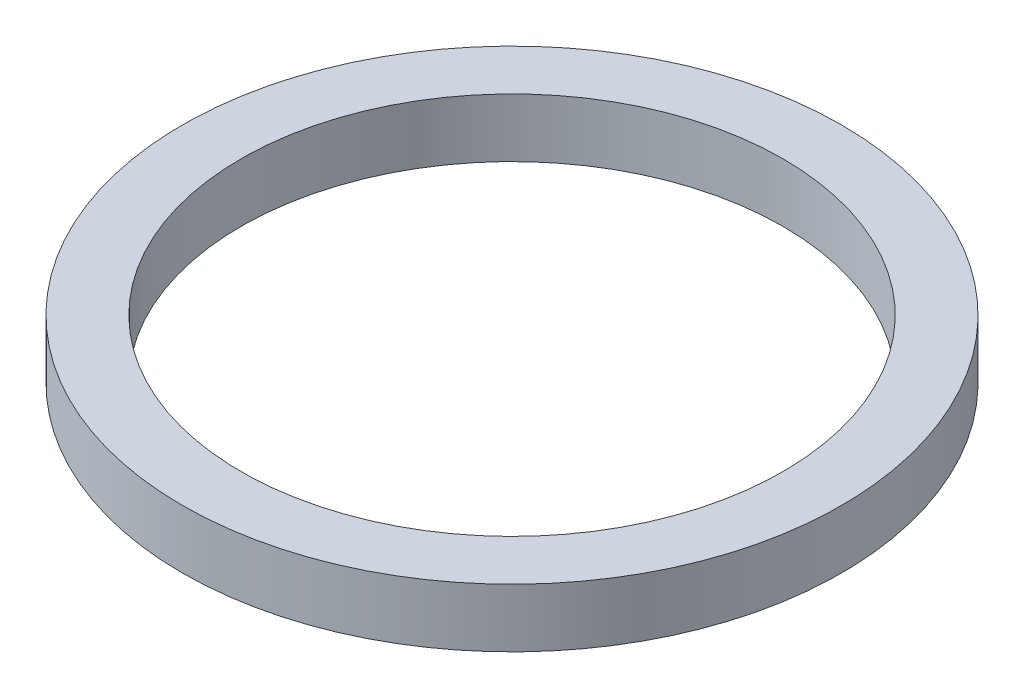
ISO-10303-21;
HEADER;
FILE_DESCRIPTION(('STEP AP214'),'2;1');
FILE_NAME('part.step','',(''),(''),'','','');
FILE_SCHEMA(('AUTOMOTIVE_DESIGN { 1 0 10303 214 1 1 1 1 }'));
ENDSEC;
DATA;
#1=APPLICATION_CONTEXT('core data for automotive mechanical design processes');
#2=APPLICATION_PROTOCOL_DEFINITION('international standard','automotive_design',2000,#1);
#3=PRODUCT_CONTEXT('',#1,'mechanical');
#4=PRODUCT('Part','Part','',(#3));
#5=PRODUCT_RELATED_PRODUCT_CATEGORY('part','',(#4));
#6=PRODUCT_DEFINITION_FORMATION('','',#4);
#7=PRODUCT_DEFINITION_CONTEXT('part definition',#1,'design');
#8=PRODUCT_DEFINITION('design','',#6,#7);
#9=PRODUCT_DEFINITION_SHAPE('','',#8);
#10=(LENGTH_UNIT() NAMED_UNIT(*) SI_UNIT(.MILLI.,.METRE.));
#11=(NAMED_UNIT(*) PLANE_ANGLE_UNIT() SI_UNIT($,.RADIAN.));
#12=(NAMED_UNIT(*) SI_UNIT($,.STERADIAN.) SOLID_ANGLE_UNIT());
#13=UNCERTAINTY_MEASURE_WITH_UNIT(LENGTH_MEASURE(1.E-05),#10,'distance_accuracy_value','');
#14=(GEOMETRIC_REPRESENTATION_CONTEXT(3) GLOBAL_UNCERTAINTY_ASSIGNED_CONTEXT((#13)) GLOBAL_UNIT_ASSIGNED_CONTEXT((#10,
#11,#12)) REPRESENTATION_CONTEXT('',''));
#15=CARTESIAN_POINT('',(0.,0.,0.));
#16=DIRECTION('',(0.,0.,1.));
#17=DIRECTION('',(1.,0.,0.));
#18=AXIS2_PLACEMENT_3D('',#15,#16,#17);
#19=CARTESIAN_POINT('',(45.,8.,0.));
#20=DIRECTION('',(0.,1.,0.));
#21=DIRECTION('',(0.,0.,1.));
#22=AXIS2_PLACEMENT_3D('',#19,#20,#21);
#23=PLANE('',#22);
#24=CARTESIAN_POINT('',(0.,8.,0.));
#25=DIRECTION('',(0.,-1.,0.));
#26=DIRECTION('',(0.,0.,-1.));
#27=AXIS2_PLACEMENT_3D('',#24,#25,#26);
#28=CIRCLE('',#27,37.);
#29=CARTESIAN_POINT('',(0.,8.,-37.));
#30=VERTEX_POINT('',#29);
#31=EDGE_CURVE('E10',#30,#30,#28,.T.);
#32=ORIENTED_EDGE('',*,*,#31,.T.);
#33=EDGE_LOOP('',(#32));
#34=FACE_BOUND('',#33,.T.);
#35=CARTESIAN_POINT('',(0.,8.,0.));
#36=DIRECTION('',(0.,-1.,0.));
#37=DIRECTION('',(0.,0.,-1.));
#38=AXIS2_PLACEMENT_3D('',#35,#36,#37);
#39=CIRCLE('',#38,45.);
#40=CARTESIAN_POINT('',(0.,8.,-45.));
#41=VERTEX_POINT('',#40);
#42=EDGE_CURVE('E44',#41,#41,#39,.T.);
#43=ORIENTED_EDGE('',*,*,#42,.F.);
#44=EDGE_LOOP('',(#43));
#45=FACE_BOUND('',#44,.T.);
#46=ADVANCED_FACE('F30',(#34,#45),#23,.T.);
#47=CARTESIAN_POINT('',(0.,0.,0.));
#48=DIRECTION('',(0.,-1.,0.));
#49=DIRECTION('',(0.,0.,-1.));
#50=AXIS2_PLACEMENT_3D('',#47,#48,#49);
#51=CYLINDRICAL_SURFACE('',#50,37.);
#52=CARTESIAN_POINT('',(0.,0.,0.));
#53=DIRECTION('',(0.,-1.,0.));
#54=DIRECTION('',(0.,0.,-1.));
#55=AXIS2_PLACEMENT_3D('',#52,#53,#54);
#56=CIRCLE('',#55,37.);
#57=CARTESIAN_POINT('',(0.,0.,-37.));
#58=VERTEX_POINT('',#57);
#59=EDGE_CURVE('E36',#58,#58,#56,.T.);
#60=ORIENTED_EDGE('',*,*,#59,.T.);
#61=EDGE_LOOP('',(#60));
#62=FACE_BOUND('',#61,.T.);
#63=ORIENTED_EDGE('',*,*,#31,.F.);
#64=EDGE_LOOP('',(#63));
#65=FACE_BOUND('',#64,.T.);
#66=ADVANCED_FACE('F54',(#62,#65),#51,.F.);
#67=CARTESIAN_POINT('',(37.,0.,0.));
#68=DIRECTION('',(0.,-1.,0.));
#69=DIRECTION('',(0.,0.,-1.));
#70=AXIS2_PLACEMENT_3D('',#67,#68,#69);
#71=PLANE('',#70);
#72=CARTESIAN_POINT('',(0.,0.,0.));
#73=DIRECTION('',(0.,-1.,0.));
#74=DIRECTION('',(0.,0.,-1.));
#75=AXIS2_PLACEMENT_3D('',#72,#73,#74);
#76=CIRCLE('',#75,45.);
#77=CARTESIAN_POINT('',(0.,0.,-45.));
#78=VERTEX_POINT('',#77);
#79=EDGE_CURVE('E40',#78,#78,#76,.T.);
#80=ORIENTED_EDGE('',*,*,#79,.T.);
#81=EDGE_LOOP('',(#80));
#82=FACE_BOUND('',#81,.T.);
#83=ORIENTED_EDGE('',*,*,#59,.F.);
#84=EDGE_LOOP('',(#83));
#85=FACE_BOUND('',#84,.T.);
#86=ADVANCED_FACE('F58',(#82,#85),#71,.T.);
#87=CARTESIAN_POINT('',(0.,0.,0.));
#88=DIRECTION('',(0.,-1.,0.));
#89=DIRECTION('',(0.,0.,-1.));
#90=AXIS2_PLACEMENT_3D('',#87,#88,#89);
#91=CYLINDRICAL_SURFACE('',#90,45.);
#92=ORIENTED_EDGE('',*,*,#42,.T.);
#93=EDGE_LOOP('',(#92));
#94=FACE_BOUND('',#93,.T.);
#95=ORIENTED_EDGE('',*,*,#79,.F.);
#96=EDGE_LOOP('',(#95));
#97=FACE_BOUND('',#96,.T.);
#98=ADVANCED_FACE('F50',(#94,#97),#91,.T.);
#99=CLOSED_SHELL('',(#46,#66,#86,#98));
#100=MANIFOLD_SOLID_BREP('B2',#99);
#101=ADVANCED_BREP_SHAPE_REPRESENTATION('',(#18,#100),#14);
#102=SHAPE_DEFINITION_REPRESENTATION(#9,#101);
ENDSEC;
END-ISO-10303-21;
